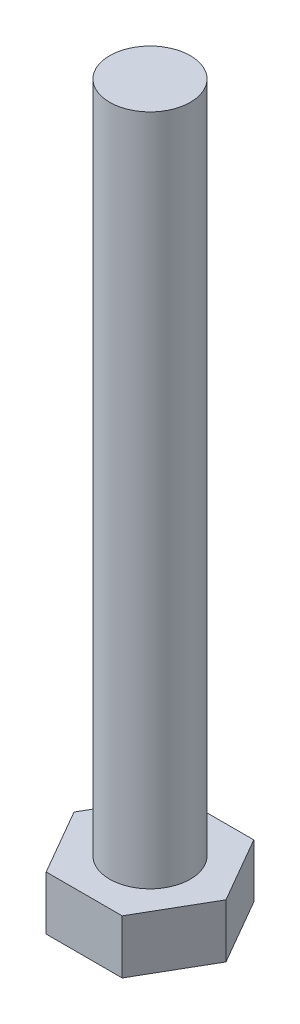
ISO-10303-21;
HEADER;
FILE_DESCRIPTION(('STEP AP214'),'2;1');
FILE_NAME('part.step','',(''),(''),'','','');
FILE_SCHEMA(('AUTOMOTIVE_DESIGN { 1 0 10303 214 1 1 1 1 }'));
ENDSEC;
DATA;
#1=APPLICATION_CONTEXT('core data for automotive mechanical design processes');
#2=APPLICATION_PROTOCOL_DEFINITION('international standard','automotive_design',2000,#1);
#3=PRODUCT_CONTEXT('',#1,'mechanical');
#4=PRODUCT('Part','Part','',(#3));
#5=PRODUCT_RELATED_PRODUCT_CATEGORY('part','',(#4));
#6=PRODUCT_DEFINITION_FORMATION('','',#4);
#7=PRODUCT_DEFINITION_CONTEXT('part definition',#1,'design');
#8=PRODUCT_DEFINITION('design','',#6,#7);
#9=PRODUCT_DEFINITION_SHAPE('','',#8);
#10=(LENGTH_UNIT() NAMED_UNIT(*) SI_UNIT(.MILLI.,.METRE.));
#11=(NAMED_UNIT(*) PLANE_ANGLE_UNIT() SI_UNIT($,.RADIAN.));
#12=(NAMED_UNIT(*) SI_UNIT($,.STERADIAN.) SOLID_ANGLE_UNIT());
#13=UNCERTAINTY_MEASURE_WITH_UNIT(LENGTH_MEASURE(1.E-05),#10,'distance_accuracy_value','');
#14=(GEOMETRIC_REPRESENTATION_CONTEXT(3) GLOBAL_UNCERTAINTY_ASSIGNED_CONTEXT((#13)) GLOBAL_UNIT_ASSIGNED_CONTEXT((#10,
#11,#12)) REPRESENTATION_CONTEXT('',''));
#15=CARTESIAN_POINT('',(0.,0.,0.));
#16=DIRECTION('',(0.,0.,1.));
#17=DIRECTION('',(1.,0.,0.));
#18=AXIS2_PLACEMENT_3D('',#15,#16,#17);
#19=CARTESIAN_POINT('',(-2.82324281633727,4.,4.89));
#20=DIRECTION('',(0.,0.,-1.));
#21=DIRECTION('',(-1.,0.,0.));
#22=AXIS2_PLACEMENT_3D('',#19,#20,#21);
#23=PLANE('',#22);
#24=DIRECTION('',(1.,0.,0.));
#25=VECTOR('',#24,1.);
#26=CARTESIAN_POINT('',(-2.82324281633727,0.,4.89));
#27=LINE('',#26,#25);
#28=CARTESIAN_POINT('',(-2.82324281633727,0.,4.89));
#29=VERTEX_POINT('',#28);
#30=CARTESIAN_POINT('',(2.82324281633727,0.,4.89));
#31=VERTEX_POINT('',#30);
#32=EDGE_CURVE('E130',#29,#31,#27,.T.);
#33=ORIENTED_EDGE('',*,*,#32,.T.);
#34=DIRECTION('',(0.,-1.,0.));
#35=VECTOR('',#34,1.);
#36=CARTESIAN_POINT('',(2.82324281633727,4.,4.89));
#37=LINE('',#36,#35);
#38=CARTESIAN_POINT('',(2.82324281633727,4.,4.89));
#39=VERTEX_POINT('',#38);
#40=EDGE_CURVE('E42',#39,#31,#37,.T.);
#41=ORIENTED_EDGE('',*,*,#40,.F.);
#42=DIRECTION('',(1.,0.,0.));
#43=VECTOR('',#42,1.);
#44=CARTESIAN_POINT('',(-2.82324281633727,4.,4.89));
#45=LINE('',#44,#43);
#46=CARTESIAN_POINT('',(-2.82324281633727,4.,4.89));
#47=VERTEX_POINT('',#46);
#48=EDGE_CURVE('E147',#47,#39,#45,.T.);
#49=ORIENTED_EDGE('',*,*,#48,.F.);
#50=DIRECTION('',(0.,-1.,0.));
#51=VECTOR('',#50,1.);
#52=CARTESIAN_POINT('',(-2.82324281633727,4.,4.89));
#53=LINE('',#52,#51);
#54=EDGE_CURVE('E126',#47,#29,#53,.T.);
#55=ORIENTED_EDGE('',*,*,#54,.T.);
#56=EDGE_LOOP('',(#33,#41,#49,#55));
#57=FACE_BOUND('',#56,.T.);
#58=ADVANCED_FACE('F39',(#57),#23,.F.);
#59=CARTESIAN_POINT('',(2.82324281633727,4.,4.89));
#60=DIRECTION('',(-0.866025403784439,0.,-0.5));
#61=DIRECTION('',(-0.5,0.,0.866025403784439));
#62=AXIS2_PLACEMENT_3D('',#59,#60,#61);
#63=PLANE('',#62);
#64=DIRECTION('',(0.5,0.,-0.866025403784439));
#65=VECTOR('',#64,1.);
#66=CARTESIAN_POINT('',(2.82324281633727,0.,4.89));
#67=LINE('',#66,#65);
#68=CARTESIAN_POINT('',(5.64648563267454,0.,0.));
#69=VERTEX_POINT('',#68);
#70=EDGE_CURVE('E134',#31,#69,#67,.T.);
#71=ORIENTED_EDGE('',*,*,#70,.T.);
#72=DIRECTION('',(0.,-1.,0.));
#73=VECTOR('',#72,1.);
#74=CARTESIAN_POINT('',(5.64648563267454,4.,0.));
#75=LINE('',#74,#73);
#76=CARTESIAN_POINT('',(5.64648563267454,4.,0.));
#77=VERTEX_POINT('',#76);
#78=EDGE_CURVE('E153',#77,#69,#75,.T.);
#79=ORIENTED_EDGE('',*,*,#78,.F.);
#80=DIRECTION('',(0.5,0.,-0.866025403784439));
#81=VECTOR('',#80,1.);
#82=CARTESIAN_POINT('',(2.82324281633727,4.,4.89));
#83=LINE('',#82,#81);
#84=EDGE_CURVE('E95',#39,#77,#83,.T.);
#85=ORIENTED_EDGE('',*,*,#84,.F.);
#86=ORIENTED_EDGE('',*,*,#40,.T.);
#87=EDGE_LOOP('',(#71,#79,#85,#86));
#88=FACE_BOUND('',#87,.T.);
#89=ADVANCED_FACE('F160',(#88),#63,.F.);
#90=CARTESIAN_POINT('',(5.64648563267454,4.,0.));
#91=DIRECTION('',(-0.866025403784439,0.,0.5));
#92=DIRECTION('',(0.5,0.,0.866025403784439));
#93=AXIS2_PLACEMENT_3D('',#90,#91,#92);
#94=PLANE('',#93);
#95=DIRECTION('',(-0.5,0.,-0.866025403784439));
#96=VECTOR('',#95,1.);
#97=CARTESIAN_POINT('',(5.64648563267454,0.,0.));
#98=LINE('',#97,#96);
#99=CARTESIAN_POINT('',(2.82324281633727,0.,-4.89));
#100=VERTEX_POINT('',#99);
#101=EDGE_CURVE('E138',#69,#100,#98,.T.);
#102=ORIENTED_EDGE('',*,*,#101,.T.);
#103=DIRECTION('',(0.,-1.,0.));
#104=VECTOR('',#103,1.);
#105=CARTESIAN_POINT('',(2.82324281633727,4.,-4.89));
#106=LINE('',#105,#104);
#107=CARTESIAN_POINT('',(2.82324281633727,4.,-4.89));
#108=VERTEX_POINT('',#107);
#109=EDGE_CURVE('E119',#108,#100,#106,.T.);
#110=ORIENTED_EDGE('',*,*,#109,.F.);
#111=DIRECTION('',(-0.5,0.,-0.866025403784439));
#112=VECTOR('',#111,1.);
#113=CARTESIAN_POINT('',(5.64648563267454,4.,0.));
#114=LINE('',#113,#112);
#115=EDGE_CURVE('E108',#77,#108,#114,.T.);
#116=ORIENTED_EDGE('',*,*,#115,.F.);
#117=ORIENTED_EDGE('',*,*,#78,.T.);
#118=EDGE_LOOP('',(#102,#110,#116,#117));
#119=FACE_BOUND('',#118,.T.);
#120=ADVANCED_FACE('F166',(#119),#94,.F.);
#121=CARTESIAN_POINT('',(2.82324281633727,4.,-4.89));
#122=DIRECTION('',(0.,0.,1.));
#123=DIRECTION('',(1.,0.,0.));
#124=AXIS2_PLACEMENT_3D('',#121,#122,#123);
#125=PLANE('',#124);
#126=DIRECTION('',(-1.,0.,0.));
#127=VECTOR('',#126,1.);
#128=CARTESIAN_POINT('',(2.82324281633727,0.,-4.89));
#129=LINE('',#128,#127);
#130=CARTESIAN_POINT('',(-2.82324281633727,0.,-4.89));
#131=VERTEX_POINT('',#130);
#132=EDGE_CURVE('E117',#100,#131,#129,.T.);
#133=ORIENTED_EDGE('',*,*,#132,.T.);
#134=DIRECTION('',(0.,-1.,0.));
#135=VECTOR('',#134,1.);
#136=CARTESIAN_POINT('',(-2.82324281633727,4.,-4.89));
#137=LINE('',#136,#135);
#138=CARTESIAN_POINT('',(-2.82324281633727,4.,-4.89));
#139=VERTEX_POINT('',#138);
#140=EDGE_CURVE('E114',#139,#131,#137,.T.);
#141=ORIENTED_EDGE('',*,*,#140,.F.);
#142=DIRECTION('',(-1.,0.,0.));
#143=VECTOR('',#142,1.);
#144=CARTESIAN_POINT('',(2.82324281633727,4.,-4.89));
#145=LINE('',#144,#143);
#146=EDGE_CURVE('E102',#108,#139,#145,.T.);
#147=ORIENTED_EDGE('',*,*,#146,.F.);
#148=ORIENTED_EDGE('',*,*,#109,.T.);
#149=EDGE_LOOP('',(#133,#141,#147,#148));
#150=FACE_BOUND('',#149,.T.);
#151=ADVANCED_FACE('F115',(#150),#125,.F.);
#152=CARTESIAN_POINT('',(-2.82324281633727,4.,-4.89));
#153=DIRECTION('',(0.866025403784439,0.,0.5));
#154=DIRECTION('',(0.5,0.,-0.866025403784439));
#155=AXIS2_PLACEMENT_3D('',#152,#153,#154);
#156=PLANE('',#155);
#157=DIRECTION('',(-0.5,0.,0.866025403784439));
#158=VECTOR('',#157,1.);
#159=CARTESIAN_POINT('',(-2.82324281633727,0.,-4.89));
#160=LINE('',#159,#158);
#161=CARTESIAN_POINT('',(-5.64648563267454,0.,0.));
#162=VERTEX_POINT('',#161);
#163=EDGE_CURVE('E80',#131,#162,#160,.T.);
#164=ORIENTED_EDGE('',*,*,#163,.T.);
#165=DIRECTION('',(0.,-1.,0.));
#166=VECTOR('',#165,1.);
#167=CARTESIAN_POINT('',(-5.64648563267454,4.,0.));
#168=LINE('',#167,#166);
#169=CARTESIAN_POINT('',(-5.64648563267454,4.,0.));
#170=VERTEX_POINT('',#169);
#171=EDGE_CURVE('E120',#170,#162,#168,.T.);
#172=ORIENTED_EDGE('',*,*,#171,.F.);
#173=DIRECTION('',(-0.5,0.,0.866025403784439));
#174=VECTOR('',#173,1.);
#175=CARTESIAN_POINT('',(-2.82324281633727,4.,-4.89));
#176=LINE('',#175,#174);
#177=EDGE_CURVE('E106',#139,#170,#176,.T.);
#178=ORIENTED_EDGE('',*,*,#177,.F.);
#179=ORIENTED_EDGE('',*,*,#140,.T.);
#180=EDGE_LOOP('',(#164,#172,#178,#179));
#181=FACE_BOUND('',#180,.T.);
#182=ADVANCED_FACE('F122',(#181),#156,.F.);
#183=CARTESIAN_POINT('',(-5.64648563267454,4.,0.));
#184=DIRECTION('',(0.866025403784439,0.,-0.5));
#185=DIRECTION('',(-0.5,0.,-0.866025403784439));
#186=AXIS2_PLACEMENT_3D('',#183,#184,#185);
#187=PLANE('',#186);
#188=DIRECTION('',(0.5,0.,0.866025403784439));
#189=VECTOR('',#188,1.);
#190=CARTESIAN_POINT('',(-5.64648563267454,0.,0.));
#191=LINE('',#190,#189);
#192=EDGE_CURVE('E86',#162,#29,#191,.T.);
#193=ORIENTED_EDGE('',*,*,#192,.T.);
#194=ORIENTED_EDGE('',*,*,#54,.F.);
#195=DIRECTION('',(0.5,0.,0.866025403784439));
#196=VECTOR('',#195,1.);
#197=CARTESIAN_POINT('',(-5.64648563267454,4.,0.));
#198=LINE('',#197,#196);
#199=EDGE_CURVE('E57',#170,#47,#198,.T.);
#200=ORIENTED_EDGE('',*,*,#199,.F.);
#201=ORIENTED_EDGE('',*,*,#171,.T.);
#202=EDGE_LOOP('',(#193,#194,#200,#201));
#203=FACE_BOUND('',#202,.T.);
#204=ADVANCED_FACE('F186',(#203),#187,.F.);
#205=CARTESIAN_POINT('',(0.,4.,0.));
#206=DIRECTION('',(0.,1.,0.));
#207=DIRECTION('',(0.,0.,1.));
#208=AXIS2_PLACEMENT_3D('',#205,#206,#207);
#209=PLANE('',#208);
#210=CARTESIAN_POINT('',(0.,4.,0.));
#211=DIRECTION('',(0.,1.,0.));
#212=DIRECTION('',(0.,0.,1.));
#213=AXIS2_PLACEMENT_3D('',#210,#211,#212);
#214=CIRCLE('',#213,3.);
#215=CARTESIAN_POINT('',(0.,4.,3.));
#216=VERTEX_POINT('',#215);
#217=EDGE_CURVE('E11',#216,#216,#214,.T.);
#218=ORIENTED_EDGE('',*,*,#217,.F.);
#219=EDGE_LOOP('',(#218));
#220=FACE_BOUND('',#219,.T.);
#221=ORIENTED_EDGE('',*,*,#48,.T.);
#222=ORIENTED_EDGE('',*,*,#84,.T.);
#223=ORIENTED_EDGE('',*,*,#115,.T.);
#224=ORIENTED_EDGE('',*,*,#146,.T.);
#225=ORIENTED_EDGE('',*,*,#177,.T.);
#226=ORIENTED_EDGE('',*,*,#199,.T.);
#227=EDGE_LOOP('',(#221,#222,#223,#224,#225,#226));
#228=FACE_BOUND('',#227,.T.);
#229=ADVANCED_FACE('F104',(#220,#228),#209,.T.);
#230=CARTESIAN_POINT('',(0.,0.,0.));
#231=DIRECTION('',(0.,1.,0.));
#232=DIRECTION('',(0.,0.,1.));
#233=AXIS2_PLACEMENT_3D('',#230,#231,#232);
#234=PLANE('',#233);
#235=ORIENTED_EDGE('',*,*,#32,.F.);
#236=ORIENTED_EDGE('',*,*,#192,.F.);
#237=ORIENTED_EDGE('',*,*,#163,.F.);
#238=ORIENTED_EDGE('',*,*,#132,.F.);
#239=ORIENTED_EDGE('',*,*,#101,.F.);
#240=ORIENTED_EDGE('',*,*,#70,.F.);
#241=EDGE_LOOP('',(#235,#236,#237,#238,#239,#240));
#242=FACE_BOUND('',#241,.T.);
#243=ADVANCED_FACE('F165',(#242),#234,.F.);
#244=CARTESIAN_POINT('',(0.,54.,0.));
#245=DIRECTION('',(0.,-1.,0.));
#246=DIRECTION('',(0.,0.,-1.));
#247=AXIS2_PLACEMENT_3D('',#244,#245,#246);
#248=CYLINDRICAL_SURFACE('',#247,3.);
#249=CARTESIAN_POINT('',(0.,54.,0.));
#250=DIRECTION('',(0.,1.,0.));
#251=DIRECTION('',(0.,0.,1.));
#252=AXIS2_PLACEMENT_3D('',#249,#250,#251);
#253=CIRCLE('',#252,3.);
#254=CARTESIAN_POINT('',(0.,54.,3.));
#255=VERTEX_POINT('',#254);
#256=EDGE_CURVE('E135',#255,#255,#253,.T.);
#257=ORIENTED_EDGE('',*,*,#256,.F.);
#258=EDGE_LOOP('',(#257));
#259=FACE_BOUND('',#258,.T.);
#260=ORIENTED_EDGE('',*,*,#217,.T.);
#261=EDGE_LOOP('',(#260));
#262=FACE_BOUND('',#261,.T.);
#263=ADVANCED_FACE('F179',(#259,#262),#248,.T.);
#264=CARTESIAN_POINT('',(0.,54.,0.));
#265=DIRECTION('',(0.,1.,0.));
#266=DIRECTION('',(0.,0.,1.));
#267=AXIS2_PLACEMENT_3D('',#264,#265,#266);
#268=PLANE('',#267);
#269=ORIENTED_EDGE('',*,*,#256,.T.);
#270=EDGE_LOOP('',(#269));
#271=FACE_BOUND('',#270,.T.);
#272=ADVANCED_FACE('F177',(#271),#268,.T.);
#273=CLOSED_SHELL('',(#58,#89,#120,#151,#182,#204,#229,#243,#263,#272));
#274=MANIFOLD_SOLID_BREP('B2',#273);
#275=ADVANCED_BREP_SHAPE_REPRESENTATION('',(#18,#274),#14);
#276=SHAPE_DEFINITION_REPRESENTATION(#9,#275);
ENDSEC;
END-ISO-10303-21;
